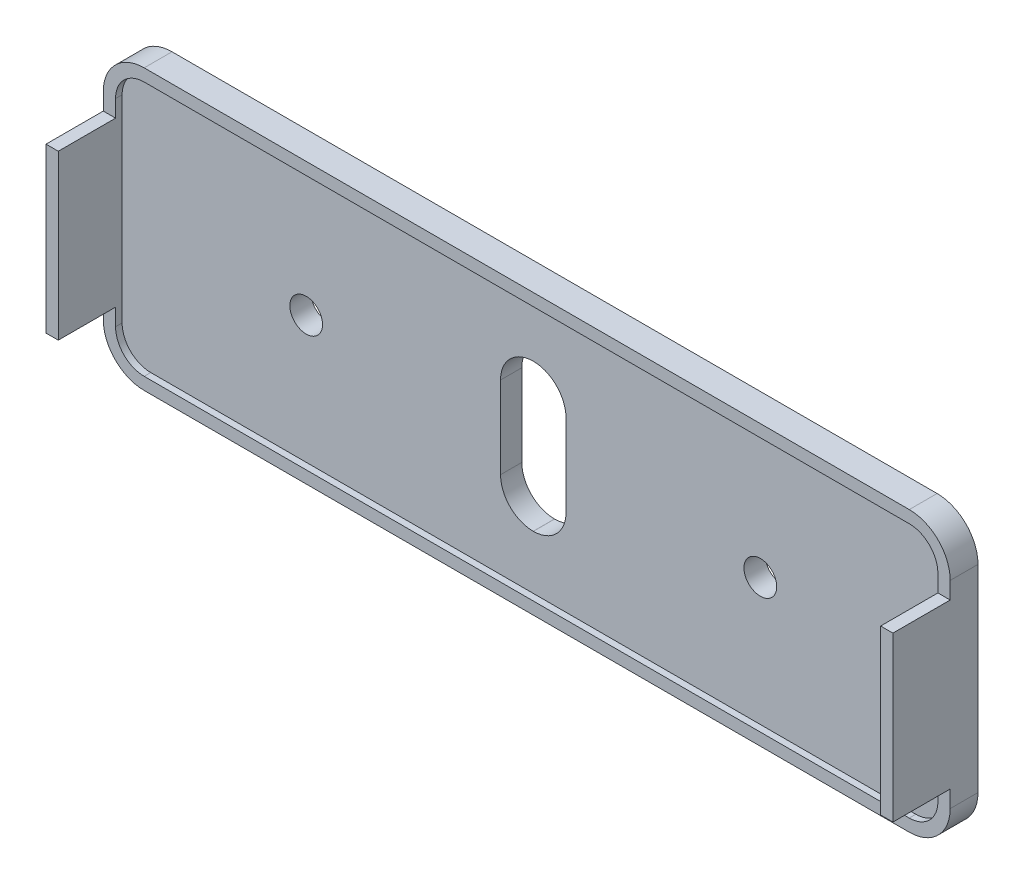
ISO-10303-21;
HEADER;
FILE_DESCRIPTION(('STEP AP214'),'2;1');
FILE_NAME('part.step','',(''),(''),'','','');
FILE_SCHEMA(('AUTOMOTIVE_DESIGN { 1 0 10303 214 1 1 1 1 }'));
ENDSEC;
DATA;
#1=APPLICATION_CONTEXT('core data for automotive mechanical design processes');
#2=APPLICATION_PROTOCOL_DEFINITION('international standard','automotive_design',2000,#1);
#3=PRODUCT_CONTEXT('',#1,'mechanical');
#4=PRODUCT('Part','Part','',(#3));
#5=PRODUCT_RELATED_PRODUCT_CATEGORY('part','',(#4));
#6=PRODUCT_DEFINITION_FORMATION('','',#4);
#7=PRODUCT_DEFINITION_CONTEXT('part definition',#1,'design');
#8=PRODUCT_DEFINITION('design','',#6,#7);
#9=PRODUCT_DEFINITION_SHAPE('','',#8);
#10=(LENGTH_UNIT() NAMED_UNIT(*) SI_UNIT(.MILLI.,.METRE.));
#11=(NAMED_UNIT(*) PLANE_ANGLE_UNIT() SI_UNIT($,.RADIAN.));
#12=(NAMED_UNIT(*) SI_UNIT($,.STERADIAN.) SOLID_ANGLE_UNIT());
#13=UNCERTAINTY_MEASURE_WITH_UNIT(LENGTH_MEASURE(1.E-05),#10,'distance_accuracy_value','');
#14=(GEOMETRIC_REPRESENTATION_CONTEXT(3) GLOBAL_UNCERTAINTY_ASSIGNED_CONTEXT((#13)) GLOBAL_UNIT_ASSIGNED_CONTEXT((#10,
#11,#12)) REPRESENTATION_CONTEXT('',''));
#15=CARTESIAN_POINT('',(0.,0.,0.));
#16=DIRECTION('',(0.,0.,1.));
#17=DIRECTION('',(1.,0.,0.));
#18=AXIS2_PLACEMENT_3D('',#15,#16,#17);
#19=CARTESIAN_POINT('',(-46.75,12.075,3.4));
#20=DIRECTION('',(0.,0.,1.));
#21=DIRECTION('',(1.,0.,0.));
#22=AXIS2_PLACEMENT_3D('',#19,#20,#21);
#23=PLANE('',#22);
#24=DIRECTION('',(-1.,0.,0.));
#25=VECTOR('',#24,1.);
#26=CARTESIAN_POINT('',(51.75,-10.,3.4));
#27=LINE('',#26,#25);
#28=CARTESIAN_POINT('',(51.75,-10.,3.4));
#29=VERTEX_POINT('',#28);
#30=CARTESIAN_POINT('',(50.25,-10.,3.4));
#31=VERTEX_POINT('',#30);
#32=EDGE_CURVE('E290',#29,#31,#27,.T.);
#33=ORIENTED_EDGE('',*,*,#32,.T.);
#34=DIRECTION('',(0.,1.,0.));
#35=VECTOR('',#34,1.);
#36=CARTESIAN_POINT('',(50.25,0.,3.4));
#37=LINE('',#36,#35);
#38=CARTESIAN_POINT('',(50.25,-12.075,3.4));
#39=VERTEX_POINT('',#38);
#40=EDGE_CURVE('E261',#39,#31,#37,.T.);
#41=ORIENTED_EDGE('',*,*,#40,.F.);
#42=CARTESIAN_POINT('',(46.75,-12.075,3.4));
#43=DIRECTION('',(0.,0.,1.));
#44=DIRECTION('',(1.,0.,0.));
#45=AXIS2_PLACEMENT_3D('',#42,#43,#44);
#46=CIRCLE('',#45,3.5);
#47=CARTESIAN_POINT('',(46.75,-15.575,3.4));
#48=VERTEX_POINT('',#47);
#49=EDGE_CURVE('E342',#48,#39,#46,.T.);
#50=ORIENTED_EDGE('',*,*,#49,.F.);
#51=DIRECTION('',(1.,0.,0.));
#52=VECTOR('',#51,1.);
#53=CARTESIAN_POINT('',(0.,-15.575,3.4));
#54=LINE('',#53,#52);
#55=CARTESIAN_POINT('',(-46.75,-15.575,3.4));
#56=VERTEX_POINT('',#55);
#57=EDGE_CURVE('E426',#56,#48,#54,.T.);
#58=ORIENTED_EDGE('',*,*,#57,.F.);
#59=CARTESIAN_POINT('',(-46.75,-12.075,3.4));
#60=DIRECTION('',(0.,0.,1.));
#61=DIRECTION('',(1.,0.,0.));
#62=AXIS2_PLACEMENT_3D('',#59,#60,#61);
#63=CIRCLE('',#62,3.5);
#64=CARTESIAN_POINT('',(-50.25,-12.075,3.4));
#65=VERTEX_POINT('',#64);
#66=EDGE_CURVE('E422',#65,#56,#63,.T.);
#67=ORIENTED_EDGE('',*,*,#66,.F.);
#68=DIRECTION('',(0.,-1.,0.));
#69=VECTOR('',#68,1.);
#70=CARTESIAN_POINT('',(-50.25,0.,3.4));
#71=LINE('',#70,#69);
#72=CARTESIAN_POINT('',(-50.25,-10.,3.4));
#73=VERTEX_POINT('',#72);
#74=EDGE_CURVE('E417',#73,#65,#71,.T.);
#75=ORIENTED_EDGE('',*,*,#74,.F.);
#76=DIRECTION('',(1.,0.,0.));
#77=VECTOR('',#76,1.);
#78=CARTESIAN_POINT('',(-51.75,-10.,3.4));
#79=LINE('',#78,#77);
#80=CARTESIAN_POINT('',(-51.75,-10.,3.4));
#81=VERTEX_POINT('',#80);
#82=EDGE_CURVE('E69',#81,#73,#79,.T.);
#83=ORIENTED_EDGE('',*,*,#82,.F.);
#84=DIRECTION('',(0.,-1.,0.));
#85=VECTOR('',#84,1.);
#86=CARTESIAN_POINT('',(-51.75,12.075,3.4));
#87=LINE('',#86,#85);
#88=CARTESIAN_POINT('',(-51.75,-12.075,3.4));
#89=VERTEX_POINT('',#88);
#90=EDGE_CURVE('E527',#81,#89,#87,.T.);
#91=ORIENTED_EDGE('',*,*,#90,.T.);
#92=CARTESIAN_POINT('',(-46.75,-12.075,3.4));
#93=DIRECTION('',(0.,0.,1.));
#94=DIRECTION('',(1.,0.,0.));
#95=AXIS2_PLACEMENT_3D('',#92,#93,#94);
#96=CIRCLE('',#95,5.);
#97=CARTESIAN_POINT('',(-46.75,-17.075,3.4));
#98=VERTEX_POINT('',#97);
#99=EDGE_CURVE('E532',#89,#98,#96,.T.);
#100=ORIENTED_EDGE('',*,*,#99,.T.);
#101=DIRECTION('',(1.,0.,0.));
#102=VECTOR('',#101,1.);
#103=CARTESIAN_POINT('',(-46.75,-17.075,3.4));
#104=LINE('',#103,#102);
#105=CARTESIAN_POINT('',(46.75,-17.075,3.4));
#106=VERTEX_POINT('',#105);
#107=EDGE_CURVE('E535',#98,#106,#104,.T.);
#108=ORIENTED_EDGE('',*,*,#107,.T.);
#109=CARTESIAN_POINT('',(46.75,-12.075,3.4));
#110=DIRECTION('',(0.,0.,1.));
#111=DIRECTION('',(1.,0.,0.));
#112=AXIS2_PLACEMENT_3D('',#109,#110,#111);
#113=CIRCLE('',#112,5.);
#114=CARTESIAN_POINT('',(51.75,-12.075,3.4));
#115=VERTEX_POINT('',#114);
#116=EDGE_CURVE('E538',#106,#115,#113,.T.);
#117=ORIENTED_EDGE('',*,*,#116,.T.);
#118=DIRECTION('',(0.,1.,0.));
#119=VECTOR('',#118,1.);
#120=CARTESIAN_POINT('',(51.75,12.075,3.4));
#121=LINE('',#120,#119);
#122=EDGE_CURVE('E542',#115,#29,#121,.T.);
#123=ORIENTED_EDGE('',*,*,#122,.T.);
#124=EDGE_LOOP('',(#33,#41,#50,#58,#67,#75,#83,#91,#100,#108,#117,#123));
#125=FACE_BOUND('',#124,.T.);
#126=ADVANCED_FACE('F45',(#125),#23,.T.);
#127=CARTESIAN_POINT('',(-27.75,0.,3.4));
#128=DIRECTION('',(0.,0.,-1.));
#129=DIRECTION('',(-1.,0.,0.));
#130=AXIS2_PLACEMENT_3D('',#127,#128,#129);
#131=CYLINDRICAL_SURFACE('',#130,2.);
#132=CARTESIAN_POINT('',(-27.75,0.,0.));
#133=DIRECTION('',(0.,0.,1.));
#134=DIRECTION('',(1.,0.,0.));
#135=AXIS2_PLACEMENT_3D('',#132,#133,#134);
#136=CIRCLE('',#135,2.);
#137=CARTESIAN_POINT('',(-25.75,0.,0.));
#138=VERTEX_POINT('',#137);
#139=EDGE_CURVE('E518',#138,#138,#136,.T.);
#140=ORIENTED_EDGE('',*,*,#139,.F.);
#141=EDGE_LOOP('',(#140));
#142=FACE_BOUND('',#141,.T.);
#143=CARTESIAN_POINT('',(-27.75,0.,2.6));
#144=DIRECTION('',(0.,0.,1.));
#145=DIRECTION('',(1.,0.,0.));
#146=AXIS2_PLACEMENT_3D('',#143,#144,#145);
#147=CIRCLE('',#146,2.);
#148=CARTESIAN_POINT('',(-25.75,0.,2.6));
#149=VERTEX_POINT('',#148);
#150=EDGE_CURVE('E337',#149,#149,#147,.F.);
#151=ORIENTED_EDGE('',*,*,#150,.F.);
#152=EDGE_LOOP('',(#151));
#153=FACE_BOUND('',#152,.T.);
#154=ADVANCED_FACE('F684',(#142,#153),#131,.F.);
#155=CARTESIAN_POINT('',(27.75,0.,3.4));
#156=DIRECTION('',(0.,0.,-1.));
#157=DIRECTION('',(-1.,0.,0.));
#158=AXIS2_PLACEMENT_3D('',#155,#156,#157);
#159=CYLINDRICAL_SURFACE('',#158,2.);
#160=CARTESIAN_POINT('',(27.75,0.,0.));
#161=DIRECTION('',(0.,0.,1.));
#162=DIRECTION('',(1.,0.,0.));
#163=AXIS2_PLACEMENT_3D('',#160,#161,#162);
#164=CIRCLE('',#163,2.);
#165=CARTESIAN_POINT('',(29.75,0.,0.));
#166=VERTEX_POINT('',#165);
#167=EDGE_CURVE('E514',#166,#166,#164,.T.);
#168=ORIENTED_EDGE('',*,*,#167,.F.);
#169=EDGE_LOOP('',(#168));
#170=FACE_BOUND('',#169,.T.);
#171=CARTESIAN_POINT('',(27.75,0.,2.6));
#172=DIRECTION('',(0.,0.,1.));
#173=DIRECTION('',(1.,0.,0.));
#174=AXIS2_PLACEMENT_3D('',#171,#172,#173);
#175=CIRCLE('',#174,2.);
#176=CARTESIAN_POINT('',(29.75,0.,2.6));
#177=VERTEX_POINT('',#176);
#178=EDGE_CURVE('E341',#177,#177,#175,.F.);
#179=ORIENTED_EDGE('',*,*,#178,.F.);
#180=EDGE_LOOP('',(#179));
#181=FACE_BOUND('',#180,.T.);
#182=ADVANCED_FACE('F691',(#170,#181),#159,.F.);
#183=CARTESIAN_POINT('',(0.00999999999999092,-5.01000000000001,3.4));
#184=DIRECTION('',(0.,0.,-1.));
#185=DIRECTION('',(-1.,0.,0.));
#186=AXIS2_PLACEMENT_3D('',#183,#184,#185);
#187=CYLINDRICAL_SURFACE('',#186,3.99);
#188=DIRECTION('',(0.,0.,-1.));
#189=VECTOR('',#188,1.);
#190=CARTESIAN_POINT('',(0.00999999999996143,-9.00000000000001,3.4));
#191=LINE('',#190,#189);
#192=CARTESIAN_POINT('',(0.00999999999996143,-9.00000000000001,2.6));
#193=VERTEX_POINT('',#192);
#194=CARTESIAN_POINT('',(0.00999999999996143,-9.00000000000001,0.));
#195=VERTEX_POINT('',#194);
#196=EDGE_CURVE('E490',#193,#195,#191,.T.);
#197=ORIENTED_EDGE('',*,*,#196,.F.);
#198=CARTESIAN_POINT('',(0.00999999999999092,-5.01000000000001,2.6));
#199=DIRECTION('',(0.,0.,1.));
#200=DIRECTION('',(1.,0.,0.));
#201=AXIS2_PLACEMENT_3D('',#198,#199,#200);
#202=CIRCLE('',#201,3.99);
#203=CARTESIAN_POINT('',(3.99999999999999,-5.01000000000001,2.6));
#204=VERTEX_POINT('',#203);
#205=EDGE_CURVE('E352',#204,#193,#202,.F.);
#206=ORIENTED_EDGE('',*,*,#205,.F.);
#207=DIRECTION('',(0.,0.,-1.));
#208=VECTOR('',#207,1.);
#209=CARTESIAN_POINT('',(3.99999999999999,-5.00999999999998,3.4));
#210=LINE('',#209,#208);
#211=CARTESIAN_POINT('',(3.99999999999999,-5.00999999999998,0.));
#212=VERTEX_POINT('',#211);
#213=EDGE_CURVE('E511',#204,#212,#210,.T.);
#214=ORIENTED_EDGE('',*,*,#213,.T.);
#215=CARTESIAN_POINT('',(0.00999999999999092,-5.01000000000001,0.));
#216=DIRECTION('',(0.,0.,1.));
#217=DIRECTION('',(1.,0.,0.));
#218=AXIS2_PLACEMENT_3D('',#215,#216,#217);
#219=CIRCLE('',#218,3.99);
#220=EDGE_CURVE('E436',#195,#212,#219,.T.);
#221=ORIENTED_EDGE('',*,*,#220,.F.);
#222=EDGE_LOOP('',(#197,#206,#214,#221));
#223=FACE_BOUND('',#222,.T.);
#224=ADVANCED_FACE('F734',(#223),#187,.F.);
#225=CARTESIAN_POINT('',(3.99999999999999,5.00999999999997,3.4));
#226=DIRECTION('',(-1.,0.,0.));
#227=DIRECTION('',(0.,-1.,0.));
#228=AXIS2_PLACEMENT_3D('',#225,#226,#227);
#229=PLANE('',#228);
#230=ORIENTED_EDGE('',*,*,#213,.F.);
#231=DIRECTION('',(0.,-1.,0.));
#232=VECTOR('',#231,1.);
#233=CARTESIAN_POINT('',(3.99999999999999,0.,2.6));
#234=LINE('',#233,#232);
#235=CARTESIAN_POINT('',(3.99999999999999,5.00999999999999,2.6));
#236=VERTEX_POINT('',#235);
#237=EDGE_CURVE('E349',#236,#204,#234,.T.);
#238=ORIENTED_EDGE('',*,*,#237,.F.);
#239=DIRECTION('',(0.,0.,-1.));
#240=VECTOR('',#239,1.);
#241=CARTESIAN_POINT('',(3.99999999999999,5.00999999999997,3.4));
#242=LINE('',#241,#240);
#243=CARTESIAN_POINT('',(3.99999999999999,5.00999999999997,0.));
#244=VERTEX_POINT('',#243);
#245=EDGE_CURVE('E508',#236,#244,#242,.T.);
#246=ORIENTED_EDGE('',*,*,#245,.T.);
#247=DIRECTION('',(0.,1.,0.));
#248=VECTOR('',#247,1.);
#249=CARTESIAN_POINT('',(3.99999999999999,5.00999999999997,0.));
#250=LINE('',#249,#248);
#251=EDGE_CURVE('E462',#212,#244,#250,.T.);
#252=ORIENTED_EDGE('',*,*,#251,.F.);
#253=EDGE_LOOP('',(#230,#238,#246,#252));
#254=FACE_BOUND('',#253,.T.);
#255=ADVANCED_FACE('F730',(#254),#229,.T.);
#256=CARTESIAN_POINT('',(0.00999999999998918,5.00999999999999,3.4));
#257=DIRECTION('',(0.,0.,-1.));
#258=DIRECTION('',(-1.,0.,0.));
#259=AXIS2_PLACEMENT_3D('',#256,#257,#258);
#260=CYLINDRICAL_SURFACE('',#259,3.99);
#261=ORIENTED_EDGE('',*,*,#245,.F.);
#262=CARTESIAN_POINT('',(0.00999999999998918,5.00999999999999,2.6));
#263=DIRECTION('',(0.,0.,1.));
#264=DIRECTION('',(1.,0.,0.));
#265=AXIS2_PLACEMENT_3D('',#262,#263,#264);
#266=CIRCLE('',#265,3.99);
#267=CARTESIAN_POINT('',(0.00999999999996059,8.99999999999999,2.6));
#268=VERTEX_POINT('',#267);
#269=EDGE_CURVE('E346',#268,#236,#266,.F.);
#270=ORIENTED_EDGE('',*,*,#269,.F.);
#271=DIRECTION('',(0.,0.,-1.));
#272=VECTOR('',#271,1.);
#273=CARTESIAN_POINT('',(0.00999999999996056,8.99999999999999,3.4));
#274=LINE('',#273,#272);
#275=CARTESIAN_POINT('',(0.00999999999996056,8.99999999999999,0.));
#276=VERTEX_POINT('',#275);
#277=EDGE_CURVE('E505',#268,#276,#274,.T.);
#278=ORIENTED_EDGE('',*,*,#277,.T.);
#279=CARTESIAN_POINT('',(0.00999999999998918,5.00999999999999,0.));
#280=DIRECTION('',(0.,0.,1.));
#281=DIRECTION('',(-1.,0.,0.));
#282=AXIS2_PLACEMENT_3D('',#279,#280,#281);
#283=CIRCLE('',#282,3.99);
#284=EDGE_CURVE('E466',#244,#276,#283,.T.);
#285=ORIENTED_EDGE('',*,*,#284,.F.);
#286=EDGE_LOOP('',(#261,#270,#278,#285));
#287=FACE_BOUND('',#286,.T.);
#288=ADVANCED_FACE('F726',(#287),#260,.F.);
#289=CARTESIAN_POINT('',(-0.00999999999998138,8.99999999999999,3.4));
#290=DIRECTION('',(0.,-1.,0.));
#291=DIRECTION('',(0.,0.,-1.));
#292=AXIS2_PLACEMENT_3D('',#289,#290,#291);
#293=PLANE('',#292);
#294=ORIENTED_EDGE('',*,*,#277,.F.);
#295=DIRECTION('',(1.,0.,0.));
#296=VECTOR('',#295,1.);
#297=CARTESIAN_POINT('',(0.,8.99999999999999,2.6));
#298=LINE('',#297,#296);
#299=CARTESIAN_POINT('',(-0.00999999999998139,8.99999999999999,2.6));
#300=VERTEX_POINT('',#299);
#301=EDGE_CURVE('E367',#300,#268,#298,.T.);
#302=ORIENTED_EDGE('',*,*,#301,.F.);
#303=DIRECTION('',(0.,0.,-1.));
#304=VECTOR('',#303,1.);
#305=CARTESIAN_POINT('',(-0.00999999999998139,8.99999999999999,3.4));
#306=LINE('',#305,#304);
#307=CARTESIAN_POINT('',(-0.00999999999998139,8.99999999999999,0.));
#308=VERTEX_POINT('',#307);
#309=EDGE_CURVE('E502',#300,#308,#306,.T.);
#310=ORIENTED_EDGE('',*,*,#309,.T.);
#311=DIRECTION('',(-1.,0.,0.));
#312=VECTOR('',#311,1.);
#313=CARTESIAN_POINT('',(-0.00999999999998138,8.99999999999999,0.));
#314=LINE('',#313,#312);
#315=EDGE_CURVE('E470',#276,#308,#314,.T.);
#316=ORIENTED_EDGE('',*,*,#315,.F.);
#317=EDGE_LOOP('',(#294,#302,#310,#316));
#318=FACE_BOUND('',#317,.T.);
#319=ADVANCED_FACE('F722',(#318),#293,.T.);
#320=CARTESIAN_POINT('',(-0.0100000000000109,5.00999999999999,3.4));
#321=DIRECTION('',(0.,0.,-1.));
#322=DIRECTION('',(-1.,0.,0.));
#323=AXIS2_PLACEMENT_3D('',#320,#321,#322);
#324=CYLINDRICAL_SURFACE('',#323,3.99);
#325=ORIENTED_EDGE('',*,*,#309,.F.);
#326=CARTESIAN_POINT('',(-0.0100000000000109,5.00999999999999,2.6));
#327=DIRECTION('',(0.,0.,1.));
#328=DIRECTION('',(1.,0.,0.));
#329=AXIS2_PLACEMENT_3D('',#326,#327,#328);
#330=CIRCLE('',#329,3.99);
#331=CARTESIAN_POINT('',(-4.00000000000001,5.00999999999997,2.6));
#332=VERTEX_POINT('',#331);
#333=EDGE_CURVE('E364',#332,#300,#330,.F.);
#334=ORIENTED_EDGE('',*,*,#333,.F.);
#335=DIRECTION('',(0.,0.,-1.));
#336=VECTOR('',#335,1.);
#337=CARTESIAN_POINT('',(-4.00000000000001,5.00999999999997,3.4));
#338=LINE('',#337,#336);
#339=CARTESIAN_POINT('',(-4.00000000000001,5.00999999999997,0.));
#340=VERTEX_POINT('',#339);
#341=EDGE_CURVE('E499',#332,#340,#338,.T.);
#342=ORIENTED_EDGE('',*,*,#341,.T.);
#343=CARTESIAN_POINT('',(-0.0100000000000109,5.00999999999999,0.));
#344=DIRECTION('',(0.,0.,1.));
#345=DIRECTION('',(1.,0.,0.));
#346=AXIS2_PLACEMENT_3D('',#343,#344,#345);
#347=CIRCLE('',#346,3.99);
#348=EDGE_CURVE('E474',#308,#340,#347,.T.);
#349=ORIENTED_EDGE('',*,*,#348,.F.);
#350=EDGE_LOOP('',(#325,#334,#342,#349));
#351=FACE_BOUND('',#350,.T.);
#352=ADVANCED_FACE('F718',(#351),#324,.F.);
#353=CARTESIAN_POINT('',(-4.00000000000001,5.00999999999997,3.4));
#354=DIRECTION('',(1.,0.,0.));
#355=DIRECTION('',(0.,1.,0.));
#356=AXIS2_PLACEMENT_3D('',#353,#354,#355);
#357=PLANE('',#356);
#358=ORIENTED_EDGE('',*,*,#341,.F.);
#359=DIRECTION('',(0.,1.,0.));
#360=VECTOR('',#359,1.);
#361=CARTESIAN_POINT('',(-4.00000000000001,0.,2.6));
#362=LINE('',#361,#360);
#363=CARTESIAN_POINT('',(-4.00000000000001,-5.00999999999998,2.6));
#364=VERTEX_POINT('',#363);
#365=EDGE_CURVE('E361',#364,#332,#362,.T.);
#366=ORIENTED_EDGE('',*,*,#365,.F.);
#367=DIRECTION('',(0.,0.,-1.));
#368=VECTOR('',#367,1.);
#369=CARTESIAN_POINT('',(-4.00000000000001,-5.00999999999998,3.4));
#370=LINE('',#369,#368);
#371=CARTESIAN_POINT('',(-4.00000000000001,-5.00999999999998,0.));
#372=VERTEX_POINT('',#371);
#373=EDGE_CURVE('E496',#364,#372,#370,.T.);
#374=ORIENTED_EDGE('',*,*,#373,.T.);
#375=DIRECTION('',(0.,-1.,0.));
#376=VECTOR('',#375,1.);
#377=CARTESIAN_POINT('',(-4.00000000000001,5.00999999999997,0.));
#378=LINE('',#377,#376);
#379=EDGE_CURVE('E478',#340,#372,#378,.T.);
#380=ORIENTED_EDGE('',*,*,#379,.F.);
#381=EDGE_LOOP('',(#358,#366,#374,#380));
#382=FACE_BOUND('',#381,.T.);
#383=ADVANCED_FACE('F709',(#382),#357,.T.);
#384=CARTESIAN_POINT('',(-0.01000000000001,-5.01000000000001,3.4));
#385=DIRECTION('',(0.,0.,-1.));
#386=DIRECTION('',(-1.,0.,0.));
#387=AXIS2_PLACEMENT_3D('',#384,#385,#386);
#388=CYLINDRICAL_SURFACE('',#387,3.99);
#389=ORIENTED_EDGE('',*,*,#373,.F.);
#390=CARTESIAN_POINT('',(-0.01000000000001,-5.01000000000001,2.6));
#391=DIRECTION('',(0.,0.,1.));
#392=DIRECTION('',(1.,0.,0.));
#393=AXIS2_PLACEMENT_3D('',#390,#391,#392);
#394=CIRCLE('',#393,3.99);
#395=CARTESIAN_POINT('',(-0.00999999999998229,-9.00000000000001,2.6));
#396=VERTEX_POINT('',#395);
#397=EDGE_CURVE('E358',#396,#364,#394,.F.);
#398=ORIENTED_EDGE('',*,*,#397,.F.);
#399=DIRECTION('',(0.,0.,-1.));
#400=VECTOR('',#399,1.);
#401=CARTESIAN_POINT('',(-0.00999999999998051,-9.00000000000001,3.4));
#402=LINE('',#401,#400);
#403=CARTESIAN_POINT('',(-0.00999999999998051,-9.00000000000001,0.));
#404=VERTEX_POINT('',#403);
#405=EDGE_CURVE('E493',#396,#404,#402,.T.);
#406=ORIENTED_EDGE('',*,*,#405,.T.);
#407=CARTESIAN_POINT('',(-0.01000000000001,-5.01000000000001,0.));
#408=DIRECTION('',(0.,0.,1.));
#409=DIRECTION('',(1.,0.,0.));
#410=AXIS2_PLACEMENT_3D('',#407,#408,#409);
#411=CIRCLE('',#410,3.99);
#412=EDGE_CURVE('E482',#372,#404,#411,.T.);
#413=ORIENTED_EDGE('',*,*,#412,.F.);
#414=EDGE_LOOP('',(#389,#398,#406,#413));
#415=FACE_BOUND('',#414,.T.);
#416=ADVANCED_FACE('F702',(#415),#388,.F.);
#417=CARTESIAN_POINT('',(-0.00999999999998051,-9.00000000000001,3.4));
#418=DIRECTION('',(0.,1.,0.));
#419=DIRECTION('',(0.,0.,1.));
#420=AXIS2_PLACEMENT_3D('',#417,#418,#419);
#421=PLANE('',#420);
#422=ORIENTED_EDGE('',*,*,#405,.F.);
#423=DIRECTION('',(-1.,0.,0.));
#424=VECTOR('',#423,1.);
#425=CARTESIAN_POINT('',(0.,-9.00000000000001,2.6));
#426=LINE('',#425,#424);
#427=EDGE_CURVE('E355',#193,#396,#426,.T.);
#428=ORIENTED_EDGE('',*,*,#427,.F.);
#429=ORIENTED_EDGE('',*,*,#196,.T.);
#430=DIRECTION('',(1.,0.,0.));
#431=VECTOR('',#430,1.);
#432=CARTESIAN_POINT('',(-0.00999999999998051,-9.00000000000001,0.));
#433=LINE('',#432,#431);
#434=EDGE_CURVE('E486',#404,#195,#433,.T.);
#435=ORIENTED_EDGE('',*,*,#434,.F.);
#436=EDGE_LOOP('',(#422,#428,#429,#435));
#437=FACE_BOUND('',#436,.T.);
#438=ADVANCED_FACE('F695',(#437),#421,.T.);
#439=DIRECTION('',(1.,0.,0.));
#440=VECTOR('',#439,1.);
#441=CARTESIAN_POINT('',(51.75,10.,3.4));
#442=LINE('',#441,#440);
#443=CARTESIAN_POINT('',(50.25,10.,3.4));
#444=VERTEX_POINT('',#443);
#445=CARTESIAN_POINT('',(51.75,10.,3.4));
#446=VERTEX_POINT('',#445);
#447=EDGE_CURVE('E61',#444,#446,#442,.T.);
#448=ORIENTED_EDGE('',*,*,#447,.T.);
#449=CARTESIAN_POINT('',(51.75,12.075,3.4));
#450=VERTEX_POINT('',#449);
#451=EDGE_CURVE('E541',#446,#450,#121,.T.);
#452=ORIENTED_EDGE('',*,*,#451,.T.);
#453=CARTESIAN_POINT('',(46.75,12.075,3.4));
#454=DIRECTION('',(0.,0.,1.));
#455=DIRECTION('',(-1.,0.,0.));
#456=AXIS2_PLACEMENT_3D('',#453,#454,#455);
#457=CIRCLE('',#456,5.);
#458=CARTESIAN_POINT('',(46.75,17.075,3.4));
#459=VERTEX_POINT('',#458);
#460=EDGE_CURVE('E546',#450,#459,#457,.T.);
#461=ORIENTED_EDGE('',*,*,#460,.T.);
#462=DIRECTION('',(-1.,0.,0.));
#463=VECTOR('',#462,1.);
#464=CARTESIAN_POINT('',(-46.75,17.075,3.4));
#465=LINE('',#464,#463);
#466=CARTESIAN_POINT('',(-46.75,17.075,3.4));
#467=VERTEX_POINT('',#466);
#468=EDGE_CURVE('E549',#459,#467,#465,.T.);
#469=ORIENTED_EDGE('',*,*,#468,.T.);
#470=CARTESIAN_POINT('',(-46.75,12.075,3.4));
#471=DIRECTION('',(0.,0.,1.));
#472=DIRECTION('',(1.,0.,0.));
#473=AXIS2_PLACEMENT_3D('',#470,#471,#472);
#474=CIRCLE('',#473,5.);
#475=CARTESIAN_POINT('',(-51.75,12.075,3.4));
#476=VERTEX_POINT('',#475);
#477=EDGE_CURVE('E523',#467,#476,#474,.T.);
#478=ORIENTED_EDGE('',*,*,#477,.T.);
#479=CARTESIAN_POINT('',(-51.75,10.,3.4));
#480=VERTEX_POINT('',#479);
#481=EDGE_CURVE('E529',#476,#480,#87,.T.);
#482=ORIENTED_EDGE('',*,*,#481,.T.);
#483=DIRECTION('',(-1.,0.,0.));
#484=VECTOR('',#483,1.);
#485=CARTESIAN_POINT('',(-51.75,10.,3.4));
#486=LINE('',#485,#484);
#487=CARTESIAN_POINT('',(-50.25,10.,3.4));
#488=VERTEX_POINT('',#487);
#489=EDGE_CURVE('E267',#488,#480,#486,.T.);
#490=ORIENTED_EDGE('',*,*,#489,.F.);
#491=CARTESIAN_POINT('',(-50.25,12.075,3.4));
#492=VERTEX_POINT('',#491);
#493=EDGE_CURVE('E418',#492,#488,#71,.T.);
#494=ORIENTED_EDGE('',*,*,#493,.F.);
#495=CARTESIAN_POINT('',(-46.75,12.075,3.4));
#496=DIRECTION('',(0.,0.,1.));
#497=DIRECTION('',(1.,0.,0.));
#498=AXIS2_PLACEMENT_3D('',#495,#496,#497);
#499=CIRCLE('',#498,3.5);
#500=CARTESIAN_POINT('',(-46.75,15.575,3.4));
#501=VERTEX_POINT('',#500);
#502=EDGE_CURVE('E413',#501,#492,#499,.T.);
#503=ORIENTED_EDGE('',*,*,#502,.F.);
#504=DIRECTION('',(-1.,0.,0.));
#505=VECTOR('',#504,1.);
#506=CARTESIAN_POINT('',(0.,15.575,3.4));
#507=LINE('',#506,#505);
#508=CARTESIAN_POINT('',(46.75,15.575,3.4));
#509=VERTEX_POINT('',#508);
#510=EDGE_CURVE('E409',#509,#501,#507,.T.);
#511=ORIENTED_EDGE('',*,*,#510,.F.);
#512=CARTESIAN_POINT('',(46.75,12.075,3.4));
#513=DIRECTION('',(0.,0.,1.));
#514=DIRECTION('',(1.,0.,0.));
#515=AXIS2_PLACEMENT_3D('',#512,#513,#514);
#516=CIRCLE('',#515,3.5);
#517=CARTESIAN_POINT('',(50.25,12.075,3.4));
#518=VERTEX_POINT('',#517);
#519=EDGE_CURVE('E405',#518,#509,#516,.T.);
#520=ORIENTED_EDGE('',*,*,#519,.F.);
#521=EDGE_CURVE('E336',#444,#518,#37,.T.);
#522=ORIENTED_EDGE('',*,*,#521,.F.);
#523=EDGE_LOOP('',(#448,#452,#461,#469,#478,#482,#490,#494,#503,#511,#520,#522));
#524=FACE_BOUND('',#523,.T.);
#525=ADVANCED_FACE('F635',(#524),#23,.T.);
#526=CARTESIAN_POINT('',(-46.75,12.075,0.));
#527=DIRECTION('',(0.,0.,1.));
#528=DIRECTION('',(1.,0.,0.));
#529=AXIS2_PLACEMENT_3D('',#526,#527,#528);
#530=PLANE('',#529);
#531=ORIENTED_EDGE('',*,*,#167,.T.);
#532=EDGE_LOOP('',(#531));
#533=FACE_BOUND('',#532,.T.);
#534=ORIENTED_EDGE('',*,*,#139,.T.);
#535=EDGE_LOOP('',(#534));
#536=FACE_BOUND('',#535,.T.);
#537=CARTESIAN_POINT('',(-46.75,12.075,0.));
#538=DIRECTION('',(0.,0.,1.));
#539=DIRECTION('',(1.,0.,0.));
#540=AXIS2_PLACEMENT_3D('',#537,#538,#539);
#541=CIRCLE('',#540,5.);
#542=CARTESIAN_POINT('',(-46.75,17.075,0.));
#543=VERTEX_POINT('',#542);
#544=CARTESIAN_POINT('',(-51.75,12.075,0.));
#545=VERTEX_POINT('',#544);
#546=EDGE_CURVE('E522',#543,#545,#541,.T.);
#547=ORIENTED_EDGE('',*,*,#546,.F.);
#548=DIRECTION('',(-1.,0.,0.));
#549=VECTOR('',#548,1.);
#550=CARTESIAN_POINT('',(-46.75,17.075,0.));
#551=LINE('',#550,#549);
#552=CARTESIAN_POINT('',(46.75,17.075,0.));
#553=VERTEX_POINT('',#552);
#554=EDGE_CURVE('E528',#553,#543,#551,.T.);
#555=ORIENTED_EDGE('',*,*,#554,.F.);
#556=CARTESIAN_POINT('',(46.75,12.075,0.));
#557=DIRECTION('',(0.,0.,1.));
#558=DIRECTION('',(-1.,0.,0.));
#559=AXIS2_PLACEMENT_3D('',#556,#557,#558);
#560=CIRCLE('',#559,5.);
#561=CARTESIAN_POINT('',(51.75,12.075,0.));
#562=VERTEX_POINT('',#561);
#563=EDGE_CURVE('E571',#562,#553,#560,.T.);
#564=ORIENTED_EDGE('',*,*,#563,.F.);
#565=DIRECTION('',(0.,1.,0.));
#566=VECTOR('',#565,1.);
#567=CARTESIAN_POINT('',(51.75,12.075,0.));
#568=LINE('',#567,#566);
#569=CARTESIAN_POINT('',(51.75,-12.075,0.));
#570=VERTEX_POINT('',#569);
#571=EDGE_CURVE('E568',#570,#562,#568,.T.);
#572=ORIENTED_EDGE('',*,*,#571,.F.);
#573=CARTESIAN_POINT('',(46.75,-12.075,0.));
#574=DIRECTION('',(0.,0.,1.));
#575=DIRECTION('',(1.,0.,0.));
#576=AXIS2_PLACEMENT_3D('',#573,#574,#575);
#577=CIRCLE('',#576,5.);
#578=CARTESIAN_POINT('',(46.75,-17.075,0.));
#579=VERTEX_POINT('',#578);
#580=EDGE_CURVE('E565',#579,#570,#577,.T.);
#581=ORIENTED_EDGE('',*,*,#580,.F.);
#582=DIRECTION('',(1.,0.,0.));
#583=VECTOR('',#582,1.);
#584=CARTESIAN_POINT('',(-46.75,-17.075,0.));
#585=LINE('',#584,#583);
#586=CARTESIAN_POINT('',(-46.75,-17.075,0.));
#587=VERTEX_POINT('',#586);
#588=EDGE_CURVE('E562',#587,#579,#585,.T.);
#589=ORIENTED_EDGE('',*,*,#588,.F.);
#590=CARTESIAN_POINT('',(-46.75,-12.075,0.));
#591=DIRECTION('',(0.,0.,1.));
#592=DIRECTION('',(1.,0.,0.));
#593=AXIS2_PLACEMENT_3D('',#590,#591,#592);
#594=CIRCLE('',#593,5.);
#595=CARTESIAN_POINT('',(-51.75,-12.075,0.));
#596=VERTEX_POINT('',#595);
#597=EDGE_CURVE('E559',#596,#587,#594,.T.);
#598=ORIENTED_EDGE('',*,*,#597,.F.);
#599=DIRECTION('',(0.,-1.,0.));
#600=VECTOR('',#599,1.);
#601=CARTESIAN_POINT('',(-51.75,12.075,0.));
#602=LINE('',#601,#600);
#603=EDGE_CURVE('E556',#545,#596,#602,.T.);
#604=ORIENTED_EDGE('',*,*,#603,.F.);
#605=EDGE_LOOP('',(#547,#555,#564,#572,#581,#589,#598,#604));
#606=FACE_BOUND('',#605,.T.);
#607=ORIENTED_EDGE('',*,*,#220,.T.);
#608=ORIENTED_EDGE('',*,*,#251,.T.);
#609=ORIENTED_EDGE('',*,*,#284,.T.);
#610=ORIENTED_EDGE('',*,*,#315,.T.);
#611=ORIENTED_EDGE('',*,*,#348,.T.);
#612=ORIENTED_EDGE('',*,*,#379,.T.);
#613=ORIENTED_EDGE('',*,*,#412,.T.);
#614=ORIENTED_EDGE('',*,*,#434,.T.);
#615=EDGE_LOOP('',(#607,#608,#609,#610,#611,#612,#613,#614));
#616=FACE_BOUND('',#615,.T.);
#617=ADVANCED_FACE('F610',(#533,#536,#606,#616),#530,.F.);
#618=CARTESIAN_POINT('',(-46.75,12.075,3.4));
#619=DIRECTION('',(0.,0.,-1.));
#620=DIRECTION('',(-1.,0.,0.));
#621=AXIS2_PLACEMENT_3D('',#618,#619,#620);
#622=CYLINDRICAL_SURFACE('',#621,5.);
#623=ORIENTED_EDGE('',*,*,#546,.T.);
#624=DIRECTION('',(0.,0.,-1.));
#625=VECTOR('',#624,1.);
#626=CARTESIAN_POINT('',(-51.75,12.075,3.4));
#627=LINE('',#626,#625);
#628=EDGE_CURVE('E11',#476,#545,#627,.T.);
#629=ORIENTED_EDGE('',*,*,#628,.F.);
#630=ORIENTED_EDGE('',*,*,#477,.F.);
#631=DIRECTION('',(0.,0.,-1.));
#632=VECTOR('',#631,1.);
#633=CARTESIAN_POINT('',(-46.75,17.075,3.4));
#634=LINE('',#633,#632);
#635=EDGE_CURVE('E552',#467,#543,#634,.T.);
#636=ORIENTED_EDGE('',*,*,#635,.T.);
#637=EDGE_LOOP('',(#623,#629,#630,#636));
#638=FACE_BOUND('',#637,.T.);
#639=ADVANCED_FACE('F47',(#638),#622,.T.);
#640=CARTESIAN_POINT('',(-51.75,12.075,3.4));
#641=DIRECTION('',(1.,0.,0.));
#642=DIRECTION('',(0.,0.,-1.));
#643=AXIS2_PLACEMENT_3D('',#640,#641,#642);
#644=PLANE('',#643);
#645=ORIENTED_EDGE('',*,*,#603,.T.);
#646=DIRECTION('',(0.,0.,-1.));
#647=VECTOR('',#646,1.);
#648=CARTESIAN_POINT('',(-51.75,-12.075,3.4));
#649=LINE('',#648,#647);
#650=EDGE_CURVE('E54',#89,#596,#649,.T.);
#651=ORIENTED_EDGE('',*,*,#650,.F.);
#652=ORIENTED_EDGE('',*,*,#90,.F.);
#653=DIRECTION('',(0.,0.,-1.));
#654=VECTOR('',#653,1.);
#655=CARTESIAN_POINT('',(-51.75,-10.,10.4));
#656=LINE('',#655,#654);
#657=CARTESIAN_POINT('',(-51.75,-10.,10.4));
#658=VERTEX_POINT('',#657);
#659=EDGE_CURVE('E324',#658,#81,#656,.T.);
#660=ORIENTED_EDGE('',*,*,#659,.F.);
#661=DIRECTION('',(0.,-1.,0.));
#662=VECTOR('',#661,1.);
#663=CARTESIAN_POINT('',(-51.75,10.,10.4));
#664=LINE('',#663,#662);
#665=CARTESIAN_POINT('',(-51.75,10.,10.4));
#666=VERTEX_POINT('',#665);
#667=EDGE_CURVE('E309',#666,#658,#664,.T.);
#668=ORIENTED_EDGE('',*,*,#667,.F.);
#669=DIRECTION('',(0.,0.,-1.));
#670=VECTOR('',#669,1.);
#671=CARTESIAN_POINT('',(-51.75,10.,10.4));
#672=LINE('',#671,#670);
#673=EDGE_CURVE('E328',#666,#480,#672,.T.);
#674=ORIENTED_EDGE('',*,*,#673,.T.);
#675=ORIENTED_EDGE('',*,*,#481,.F.);
#676=ORIENTED_EDGE('',*,*,#628,.T.);
#677=EDGE_LOOP('',(#645,#651,#652,#660,#668,#674,#675,#676));
#678=FACE_BOUND('',#677,.T.);
#679=ADVANCED_FACE('F665',(#678),#644,.F.);
#680=CARTESIAN_POINT('',(-46.75,-12.075,3.4));
#681=DIRECTION('',(0.,0.,-1.));
#682=DIRECTION('',(-1.,0.,0.));
#683=AXIS2_PLACEMENT_3D('',#680,#681,#682);
#684=CYLINDRICAL_SURFACE('',#683,5.);
#685=ORIENTED_EDGE('',*,*,#597,.T.);
#686=DIRECTION('',(0.,0.,-1.));
#687=VECTOR('',#686,1.);
#688=CARTESIAN_POINT('',(-46.75,-17.075,3.4));
#689=LINE('',#688,#687);
#690=EDGE_CURVE('E595',#98,#587,#689,.T.);
#691=ORIENTED_EDGE('',*,*,#690,.F.);
#692=ORIENTED_EDGE('',*,*,#99,.F.);
#693=ORIENTED_EDGE('',*,*,#650,.T.);
#694=EDGE_LOOP('',(#685,#691,#692,#693));
#695=FACE_BOUND('',#694,.T.);
#696=ADVANCED_FACE('F604',(#695),#684,.T.);
#697=CARTESIAN_POINT('',(-46.75,-17.075,3.4));
#698=DIRECTION('',(0.,1.,0.));
#699=DIRECTION('',(0.,0.,1.));
#700=AXIS2_PLACEMENT_3D('',#697,#698,#699);
#701=PLANE('',#700);
#702=ORIENTED_EDGE('',*,*,#588,.T.);
#703=DIRECTION('',(0.,0.,-1.));
#704=VECTOR('',#703,1.);
#705=CARTESIAN_POINT('',(46.75,-17.075,3.4));
#706=LINE('',#705,#704);
#707=EDGE_CURVE('E591',#106,#579,#706,.T.);
#708=ORIENTED_EDGE('',*,*,#707,.F.);
#709=ORIENTED_EDGE('',*,*,#107,.F.);
#710=ORIENTED_EDGE('',*,*,#690,.T.);
#711=EDGE_LOOP('',(#702,#708,#709,#710));
#712=FACE_BOUND('',#711,.T.);
#713=ADVANCED_FACE('F616',(#712),#701,.F.);
#714=CARTESIAN_POINT('',(46.75,-12.075,3.4));
#715=DIRECTION('',(0.,0.,-1.));
#716=DIRECTION('',(-1.,0.,0.));
#717=AXIS2_PLACEMENT_3D('',#714,#715,#716);
#718=CYLINDRICAL_SURFACE('',#717,5.);
#719=ORIENTED_EDGE('',*,*,#580,.T.);
#720=DIRECTION('',(0.,0.,-1.));
#721=VECTOR('',#720,1.);
#722=CARTESIAN_POINT('',(51.75,-12.075,3.4));
#723=LINE('',#722,#721);
#724=EDGE_CURVE('E587',#115,#570,#723,.T.);
#725=ORIENTED_EDGE('',*,*,#724,.F.);
#726=ORIENTED_EDGE('',*,*,#116,.F.);
#727=ORIENTED_EDGE('',*,*,#707,.T.);
#728=EDGE_LOOP('',(#719,#725,#726,#727));
#729=FACE_BOUND('',#728,.T.);
#730=ADVANCED_FACE('F620',(#729),#718,.T.);
#731=CARTESIAN_POINT('',(51.75,12.075,3.4));
#732=DIRECTION('',(-1.,0.,0.));
#733=DIRECTION('',(0.,-1.,0.));
#734=AXIS2_PLACEMENT_3D('',#731,#732,#733);
#735=PLANE('',#734);
#736=ORIENTED_EDGE('',*,*,#571,.T.);
#737=DIRECTION('',(0.,0.,-1.));
#738=VECTOR('',#737,1.);
#739=CARTESIAN_POINT('',(51.75,12.075,3.4));
#740=LINE('',#739,#738);
#741=EDGE_CURVE('E583',#450,#562,#740,.T.);
#742=ORIENTED_EDGE('',*,*,#741,.F.);
#743=ORIENTED_EDGE('',*,*,#451,.F.);
#744=DIRECTION('',(0.,0.,-1.));
#745=VECTOR('',#744,1.);
#746=CARTESIAN_POINT('',(51.75,10.,10.4));
#747=LINE('',#746,#745);
#748=CARTESIAN_POINT('',(51.75,10.,10.4));
#749=VERTEX_POINT('',#748);
#750=EDGE_CURVE('E297',#749,#446,#747,.T.);
#751=ORIENTED_EDGE('',*,*,#750,.F.);
#752=DIRECTION('',(0.,-1.,0.));
#753=VECTOR('',#752,1.);
#754=CARTESIAN_POINT('',(51.75,10.,10.4));
#755=LINE('',#754,#753);
#756=CARTESIAN_POINT('',(51.75,-10.,10.4));
#757=VERTEX_POINT('',#756);
#758=EDGE_CURVE('E282',#749,#757,#755,.T.);
#759=ORIENTED_EDGE('',*,*,#758,.T.);
#760=DIRECTION('',(0.,0.,-1.));
#761=VECTOR('',#760,1.);
#762=CARTESIAN_POINT('',(51.75,-10.,10.4));
#763=LINE('',#762,#761);
#764=EDGE_CURVE('E268',#757,#29,#763,.T.);
#765=ORIENTED_EDGE('',*,*,#764,.T.);
#766=ORIENTED_EDGE('',*,*,#122,.F.);
#767=ORIENTED_EDGE('',*,*,#724,.T.);
#768=EDGE_LOOP('',(#736,#742,#743,#751,#759,#765,#766,#767));
#769=FACE_BOUND('',#768,.T.);
#770=ADVANCED_FACE('F878',(#769),#735,.F.);
#771=CARTESIAN_POINT('',(46.75,12.075,3.4));
#772=DIRECTION('',(0.,0.,-1.));
#773=DIRECTION('',(-1.,0.,0.));
#774=AXIS2_PLACEMENT_3D('',#771,#772,#773);
#775=CYLINDRICAL_SURFACE('',#774,5.);
#776=ORIENTED_EDGE('',*,*,#563,.T.);
#777=DIRECTION('',(0.,0.,-1.));
#778=VECTOR('',#777,1.);
#779=CARTESIAN_POINT('',(46.75,17.075,3.4));
#780=LINE('',#779,#778);
#781=EDGE_CURVE('E579',#459,#553,#780,.T.);
#782=ORIENTED_EDGE('',*,*,#781,.F.);
#783=ORIENTED_EDGE('',*,*,#460,.F.);
#784=ORIENTED_EDGE('',*,*,#741,.T.);
#785=EDGE_LOOP('',(#776,#782,#783,#784));
#786=FACE_BOUND('',#785,.T.);
#787=ADVANCED_FACE('F868',(#786),#775,.T.);
#788=CARTESIAN_POINT('',(-46.75,17.075,3.4));
#789=DIRECTION('',(0.,-1.,0.));
#790=DIRECTION('',(0.,0.,-1.));
#791=AXIS2_PLACEMENT_3D('',#788,#789,#790);
#792=PLANE('',#791);
#793=ORIENTED_EDGE('',*,*,#554,.T.);
#794=ORIENTED_EDGE('',*,*,#635,.F.);
#795=ORIENTED_EDGE('',*,*,#468,.F.);
#796=ORIENTED_EDGE('',*,*,#781,.T.);
#797=EDGE_LOOP('',(#793,#794,#795,#796));
#798=FACE_BOUND('',#797,.T.);
#799=ADVANCED_FACE('F809',(#798),#792,.F.);
#800=CARTESIAN_POINT('',(50.25,0.,2.6));
#801=DIRECTION('',(1.,0.,0.));
#802=DIRECTION('',(0.,0.,-1.));
#803=AXIS2_PLACEMENT_3D('',#800,#801,#802);
#804=PLANE('',#803);
#805=ORIENTED_EDGE('',*,*,#40,.T.);
#806=DIRECTION('',(0.,0.,-1.));
#807=VECTOR('',#806,1.);
#808=CARTESIAN_POINT('',(50.25,-10.,10.4));
#809=LINE('',#808,#807);
#810=CARTESIAN_POINT('',(50.25,-10.,10.4));
#811=VERTEX_POINT('',#810);
#812=EDGE_CURVE('E255',#811,#31,#809,.T.);
#813=ORIENTED_EDGE('',*,*,#812,.F.);
#814=DIRECTION('',(0.,1.,0.));
#815=VECTOR('',#814,1.);
#816=CARTESIAN_POINT('',(50.25,10.,10.4));
#817=LINE('',#816,#815);
#818=CARTESIAN_POINT('',(50.25,10.,10.4));
#819=VERTEX_POINT('',#818);
#820=EDGE_CURVE('E258',#811,#819,#817,.T.);
#821=ORIENTED_EDGE('',*,*,#820,.T.);
#822=DIRECTION('',(0.,0.,-1.));
#823=VECTOR('',#822,1.);
#824=CARTESIAN_POINT('',(50.25,10.,10.4));
#825=LINE('',#824,#823);
#826=EDGE_CURVE('E289',#819,#444,#825,.T.);
#827=ORIENTED_EDGE('',*,*,#826,.T.);
#828=ORIENTED_EDGE('',*,*,#521,.T.);
#829=DIRECTION('',(0.,0.,1.));
#830=VECTOR('',#829,1.);
#831=CARTESIAN_POINT('',(50.25,12.075,2.6));
#832=LINE('',#831,#830);
#833=CARTESIAN_POINT('',(50.25,12.075,2.6));
#834=VERTEX_POINT('',#833);
#835=EDGE_CURVE('E402',#834,#518,#832,.T.);
#836=ORIENTED_EDGE('',*,*,#835,.F.);
#837=DIRECTION('',(0.,1.,0.));
#838=VECTOR('',#837,1.);
#839=CARTESIAN_POINT('',(50.25,0.,2.6));
#840=LINE('',#839,#838);
#841=CARTESIAN_POINT('',(50.25,-12.075,2.6));
#842=VERTEX_POINT('',#841);
#843=EDGE_CURVE('E370',#842,#834,#840,.T.);
#844=ORIENTED_EDGE('',*,*,#843,.F.);
#845=DIRECTION('',(0.,0.,1.));
#846=VECTOR('',#845,1.);
#847=CARTESIAN_POINT('',(50.25,-12.075,2.6));
#848=LINE('',#847,#846);
#849=EDGE_CURVE('E433',#842,#39,#848,.T.);
#850=ORIENTED_EDGE('',*,*,#849,.T.);
#851=EDGE_LOOP('',(#805,#813,#821,#827,#828,#836,#844,#850));
#852=FACE_BOUND('',#851,.T.);
#853=ADVANCED_FACE('F257',(#852),#804,.F.);
#854=CARTESIAN_POINT('',(46.75,-12.075,2.6));
#855=DIRECTION('',(0.,0.,1.));
#856=DIRECTION('',(1.,0.,0.));
#857=AXIS2_PLACEMENT_3D('',#854,#855,#856);
#858=CYLINDRICAL_SURFACE('',#857,3.5);
#859=ORIENTED_EDGE('',*,*,#49,.T.);
#860=ORIENTED_EDGE('',*,*,#849,.F.);
#861=CARTESIAN_POINT('',(46.75,-12.075,2.6));
#862=DIRECTION('',(0.,0.,1.));
#863=DIRECTION('',(1.,0.,0.));
#864=AXIS2_PLACEMENT_3D('',#861,#862,#863);
#865=CIRCLE('',#864,3.5);
#866=CARTESIAN_POINT('',(46.75,-15.575,2.6));
#867=VERTEX_POINT('',#866);
#868=EDGE_CURVE('E398',#867,#842,#865,.T.);
#869=ORIENTED_EDGE('',*,*,#868,.F.);
#870=DIRECTION('',(0.,0.,1.));
#871=VECTOR('',#870,1.);
#872=CARTESIAN_POINT('',(46.75,-15.575,2.6));
#873=LINE('',#872,#871);
#874=EDGE_CURVE('E437',#867,#48,#873,.T.);
#875=ORIENTED_EDGE('',*,*,#874,.T.);
#876=EDGE_LOOP('',(#859,#860,#869,#875));
#877=FACE_BOUND('',#876,.T.);
#878=ADVANCED_FACE('F647',(#877),#858,.F.);
#879=CARTESIAN_POINT('',(0.,-15.575,2.6));
#880=DIRECTION('',(0.,-1.,0.));
#881=DIRECTION('',(1.,0.,0.));
#882=AXIS2_PLACEMENT_3D('',#879,#880,#881);
#883=PLANE('',#882);
#884=ORIENTED_EDGE('',*,*,#57,.T.);
#885=ORIENTED_EDGE('',*,*,#874,.F.);
#886=DIRECTION('',(1.,0.,0.));
#887=VECTOR('',#886,1.);
#888=CARTESIAN_POINT('',(0.,-15.575,2.6));
#889=LINE('',#888,#887);
#890=CARTESIAN_POINT('',(-46.75,-15.575,2.6));
#891=VERTEX_POINT('',#890);
#892=EDGE_CURVE('E394',#891,#867,#889,.T.);
#893=ORIENTED_EDGE('',*,*,#892,.F.);
#894=DIRECTION('',(0.,0.,1.));
#895=VECTOR('',#894,1.);
#896=CARTESIAN_POINT('',(-46.75,-15.575,2.6));
#897=LINE('',#896,#895);
#898=EDGE_CURVE('E440',#891,#56,#897,.T.);
#899=ORIENTED_EDGE('',*,*,#898,.T.);
#900=EDGE_LOOP('',(#884,#885,#893,#899));
#901=FACE_BOUND('',#900,.T.);
#902=ADVANCED_FACE('F651',(#901),#883,.F.);
#903=CARTESIAN_POINT('',(-46.75,-12.075,2.6));
#904=DIRECTION('',(0.,0.,1.));
#905=DIRECTION('',(1.,0.,0.));
#906=AXIS2_PLACEMENT_3D('',#903,#904,#905);
#907=CYLINDRICAL_SURFACE('',#906,3.5);
#908=ORIENTED_EDGE('',*,*,#66,.T.);
#909=ORIENTED_EDGE('',*,*,#898,.F.);
#910=CARTESIAN_POINT('',(-46.75,-12.075,2.6));
#911=DIRECTION('',(0.,0.,1.));
#912=DIRECTION('',(1.,0.,0.));
#913=AXIS2_PLACEMENT_3D('',#910,#911,#912);
#914=CIRCLE('',#913,3.5);
#915=CARTESIAN_POINT('',(-50.25,-12.075,2.6));
#916=VERTEX_POINT('',#915);
#917=EDGE_CURVE('E390',#916,#891,#914,.T.);
#918=ORIENTED_EDGE('',*,*,#917,.F.);
#919=DIRECTION('',(0.,0.,1.));
#920=VECTOR('',#919,1.);
#921=CARTESIAN_POINT('',(-50.25,-12.075,2.6));
#922=LINE('',#921,#920);
#923=EDGE_CURVE('E443',#916,#65,#922,.T.);
#924=ORIENTED_EDGE('',*,*,#923,.T.);
#925=EDGE_LOOP('',(#908,#909,#918,#924));
#926=FACE_BOUND('',#925,.T.);
#927=ADVANCED_FACE('F655',(#926),#907,.F.);
#928=CARTESIAN_POINT('',(-50.25,0.,2.6));
#929=DIRECTION('',(-1.,0.,0.));
#930=DIRECTION('',(0.,0.,1.));
#931=AXIS2_PLACEMENT_3D('',#928,#929,#930);
#932=PLANE('',#931);
#933=ORIENTED_EDGE('',*,*,#493,.T.);
#934=DIRECTION('',(0.,0.,-1.));
#935=VECTOR('',#934,1.);
#936=CARTESIAN_POINT('',(-50.25,10.,10.4));
#937=LINE('',#936,#935);
#938=CARTESIAN_POINT('',(-50.25,10.,10.4));
#939=VERTEX_POINT('',#938);
#940=EDGE_CURVE('E332',#939,#488,#937,.T.);
#941=ORIENTED_EDGE('',*,*,#940,.F.);
#942=DIRECTION('',(0.,1.,0.));
#943=VECTOR('',#942,1.);
#944=CARTESIAN_POINT('',(-50.25,10.,10.4));
#945=LINE('',#944,#943);
#946=CARTESIAN_POINT('',(-50.25,-10.,10.4));
#947=VERTEX_POINT('',#946);
#948=EDGE_CURVE('E302',#947,#939,#945,.T.);
#949=ORIENTED_EDGE('',*,*,#948,.F.);
#950=DIRECTION('',(0.,0.,-1.));
#951=VECTOR('',#950,1.);
#952=CARTESIAN_POINT('',(-50.25,-10.,10.4));
#953=LINE('',#952,#951);
#954=EDGE_CURVE('E315',#947,#73,#953,.T.);
#955=ORIENTED_EDGE('',*,*,#954,.T.);
#956=ORIENTED_EDGE('',*,*,#74,.T.);
#957=ORIENTED_EDGE('',*,*,#923,.F.);
#958=DIRECTION('',(0.,-1.,0.));
#959=VECTOR('',#958,1.);
#960=CARTESIAN_POINT('',(-50.25,0.,2.6));
#961=LINE('',#960,#959);
#962=CARTESIAN_POINT('',(-50.25,12.075,2.6));
#963=VERTEX_POINT('',#962);
#964=EDGE_CURVE('E386',#963,#916,#961,.T.);
#965=ORIENTED_EDGE('',*,*,#964,.F.);
#966=DIRECTION('',(0.,0.,1.));
#967=VECTOR('',#966,1.);
#968=CARTESIAN_POINT('',(-50.25,12.075,2.6));
#969=LINE('',#968,#967);
#970=EDGE_CURVE('E447',#963,#492,#969,.T.);
#971=ORIENTED_EDGE('',*,*,#970,.T.);
#972=EDGE_LOOP('',(#933,#941,#949,#955,#956,#957,#965,#971));
#973=FACE_BOUND('',#972,.T.);
#974=ADVANCED_FACE('F658',(#973),#932,.F.);
#975=CARTESIAN_POINT('',(-46.75,12.075,2.6));
#976=DIRECTION('',(0.,0.,1.));
#977=DIRECTION('',(1.,0.,0.));
#978=AXIS2_PLACEMENT_3D('',#975,#976,#977);
#979=CYLINDRICAL_SURFACE('',#978,3.5);
#980=ORIENTED_EDGE('',*,*,#502,.T.);
#981=ORIENTED_EDGE('',*,*,#970,.F.);
#982=CARTESIAN_POINT('',(-46.75,12.075,2.6));
#983=DIRECTION('',(0.,0.,1.));
#984=DIRECTION('',(1.,0.,0.));
#985=AXIS2_PLACEMENT_3D('',#982,#983,#984);
#986=CIRCLE('',#985,3.5);
#987=CARTESIAN_POINT('',(-46.75,15.575,2.6));
#988=VERTEX_POINT('',#987);
#989=EDGE_CURVE('E382',#988,#963,#986,.T.);
#990=ORIENTED_EDGE('',*,*,#989,.F.);
#991=DIRECTION('',(0.,0.,1.));
#992=VECTOR('',#991,1.);
#993=CARTESIAN_POINT('',(-46.75,15.575,2.6));
#994=LINE('',#993,#992);
#995=EDGE_CURVE('E450',#988,#501,#994,.T.);
#996=ORIENTED_EDGE('',*,*,#995,.T.);
#997=EDGE_LOOP('',(#980,#981,#990,#996));
#998=FACE_BOUND('',#997,.T.);
#999=ADVANCED_FACE('F673',(#998),#979,.F.);
#1000=CARTESIAN_POINT('',(0.,15.575,2.6));
#1001=DIRECTION('',(0.,1.,0.));
#1002=DIRECTION('',(0.,0.,1.));
#1003=AXIS2_PLACEMENT_3D('',#1000,#1001,#1002);
#1004=PLANE('',#1003);
#1005=ORIENTED_EDGE('',*,*,#510,.T.);
#1006=ORIENTED_EDGE('',*,*,#995,.F.);
#1007=DIRECTION('',(-1.,0.,0.));
#1008=VECTOR('',#1007,1.);
#1009=CARTESIAN_POINT('',(0.,15.575,2.6));
#1010=LINE('',#1009,#1008);
#1011=CARTESIAN_POINT('',(46.75,15.575,2.6));
#1012=VERTEX_POINT('',#1011);
#1013=EDGE_CURVE('E378',#1012,#988,#1010,.T.);
#1014=ORIENTED_EDGE('',*,*,#1013,.F.);
#1015=DIRECTION('',(0.,0.,1.));
#1016=VECTOR('',#1015,1.);
#1017=CARTESIAN_POINT('',(46.75,15.575,2.6));
#1018=LINE('',#1017,#1016);
#1019=EDGE_CURVE('E453',#1012,#509,#1018,.T.);
#1020=ORIENTED_EDGE('',*,*,#1019,.T.);
#1021=EDGE_LOOP('',(#1005,#1006,#1014,#1020));
#1022=FACE_BOUND('',#1021,.T.);
#1023=ADVANCED_FACE('F639',(#1022),#1004,.F.);
#1024=CARTESIAN_POINT('',(46.75,12.075,2.6));
#1025=DIRECTION('',(0.,0.,1.));
#1026=DIRECTION('',(1.,0.,0.));
#1027=AXIS2_PLACEMENT_3D('',#1024,#1025,#1026);
#1028=CYLINDRICAL_SURFACE('',#1027,3.5);
#1029=ORIENTED_EDGE('',*,*,#519,.T.);
#1030=ORIENTED_EDGE('',*,*,#1019,.F.);
#1031=CARTESIAN_POINT('',(46.75,12.075,2.6));
#1032=DIRECTION('',(0.,0.,1.));
#1033=DIRECTION('',(1.,0.,0.));
#1034=AXIS2_PLACEMENT_3D('',#1031,#1032,#1033);
#1035=CIRCLE('',#1034,3.5);
#1036=EDGE_CURVE('E374',#834,#1012,#1035,.T.);
#1037=ORIENTED_EDGE('',*,*,#1036,.F.);
#1038=ORIENTED_EDGE('',*,*,#835,.T.);
#1039=EDGE_LOOP('',(#1029,#1030,#1037,#1038));
#1040=FACE_BOUND('',#1039,.T.);
#1041=ADVANCED_FACE('F633',(#1040),#1028,.F.);
#1042=CARTESIAN_POINT('',(0.,0.,2.6));
#1043=DIRECTION('',(0.,0.,1.));
#1044=DIRECTION('',(1.,0.,0.));
#1045=AXIS2_PLACEMENT_3D('',#1042,#1043,#1044);
#1046=PLANE('',#1045);
#1047=ORIENTED_EDGE('',*,*,#150,.T.);
#1048=EDGE_LOOP('',(#1047));
#1049=FACE_BOUND('',#1048,.T.);
#1050=ORIENTED_EDGE('',*,*,#178,.T.);
#1051=EDGE_LOOP('',(#1050));
#1052=FACE_BOUND('',#1051,.T.);
#1053=ORIENTED_EDGE('',*,*,#269,.T.);
#1054=ORIENTED_EDGE('',*,*,#237,.T.);
#1055=ORIENTED_EDGE('',*,*,#205,.T.);
#1056=ORIENTED_EDGE('',*,*,#427,.T.);
#1057=ORIENTED_EDGE('',*,*,#397,.T.);
#1058=ORIENTED_EDGE('',*,*,#365,.T.);
#1059=ORIENTED_EDGE('',*,*,#333,.T.);
#1060=ORIENTED_EDGE('',*,*,#301,.T.);
#1061=EDGE_LOOP('',(#1053,#1054,#1055,#1056,#1057,#1058,#1059,#1060));
#1062=FACE_BOUND('',#1061,.T.);
#1063=ORIENTED_EDGE('',*,*,#843,.T.);
#1064=ORIENTED_EDGE('',*,*,#1036,.T.);
#1065=ORIENTED_EDGE('',*,*,#1013,.T.);
#1066=ORIENTED_EDGE('',*,*,#989,.T.);
#1067=ORIENTED_EDGE('',*,*,#964,.T.);
#1068=ORIENTED_EDGE('',*,*,#917,.T.);
#1069=ORIENTED_EDGE('',*,*,#892,.T.);
#1070=ORIENTED_EDGE('',*,*,#868,.T.);
#1071=EDGE_LOOP('',(#1063,#1064,#1065,#1066,#1067,#1068,#1069,#1070));
#1072=FACE_BOUND('',#1071,.T.);
#1073=ADVANCED_FACE('F643',(#1049,#1052,#1062,#1072),#1046,.T.);
#1074=CARTESIAN_POINT('',(-51.75,10.,10.4));
#1075=DIRECTION('',(0.,-1.,0.));
#1076=DIRECTION('',(0.,0.,-1.));
#1077=AXIS2_PLACEMENT_3D('',#1074,#1075,#1076);
#1078=PLANE('',#1077);
#1079=ORIENTED_EDGE('',*,*,#489,.T.);
#1080=ORIENTED_EDGE('',*,*,#673,.F.);
#1081=DIRECTION('',(-1.,0.,0.));
#1082=VECTOR('',#1081,1.);
#1083=CARTESIAN_POINT('',(-51.75,10.,10.4));
#1084=LINE('',#1083,#1082);
#1085=EDGE_CURVE('E306',#939,#666,#1084,.T.);
#1086=ORIENTED_EDGE('',*,*,#1085,.F.);
#1087=ORIENTED_EDGE('',*,*,#940,.T.);
#1088=EDGE_LOOP('',(#1079,#1080,#1086,#1087));
#1089=FACE_BOUND('',#1088,.T.);
#1090=ADVANCED_FACE('F671',(#1089),#1078,.F.);
#1091=CARTESIAN_POINT('',(-51.75,-10.,10.4));
#1092=DIRECTION('',(0.,1.,0.));
#1093=DIRECTION('',(0.,0.,1.));
#1094=AXIS2_PLACEMENT_3D('',#1091,#1092,#1093);
#1095=PLANE('',#1094);
#1096=ORIENTED_EDGE('',*,*,#82,.T.);
#1097=ORIENTED_EDGE('',*,*,#954,.F.);
#1098=DIRECTION('',(1.,0.,0.));
#1099=VECTOR('',#1098,1.);
#1100=CARTESIAN_POINT('',(-51.75,-10.,10.4));
#1101=LINE('',#1100,#1099);
#1102=EDGE_CURVE('E312',#658,#947,#1101,.T.);
#1103=ORIENTED_EDGE('',*,*,#1102,.F.);
#1104=ORIENTED_EDGE('',*,*,#659,.T.);
#1105=EDGE_LOOP('',(#1096,#1097,#1103,#1104));
#1106=FACE_BOUND('',#1105,.T.);
#1107=ADVANCED_FACE('F662',(#1106),#1095,.F.);
#1108=CARTESIAN_POINT('',(0.,0.,10.4));
#1109=DIRECTION('',(0.,0.,1.));
#1110=DIRECTION('',(1.,0.,0.));
#1111=AXIS2_PLACEMENT_3D('',#1108,#1109,#1110);
#1112=PLANE('',#1111);
#1113=ORIENTED_EDGE('',*,*,#948,.T.);
#1114=ORIENTED_EDGE('',*,*,#1085,.T.);
#1115=ORIENTED_EDGE('',*,*,#667,.T.);
#1116=ORIENTED_EDGE('',*,*,#1102,.T.);
#1117=EDGE_LOOP('',(#1113,#1114,#1115,#1116));
#1118=FACE_BOUND('',#1117,.T.);
#1119=ADVANCED_FACE('F668',(#1118),#1112,.T.);
#1120=CARTESIAN_POINT('',(51.75,-10.,10.4));
#1121=DIRECTION('',(0.,-1.,0.));
#1122=DIRECTION('',(0.,0.,-1.));
#1123=AXIS2_PLACEMENT_3D('',#1120,#1121,#1122);
#1124=PLANE('',#1123);
#1125=ORIENTED_EDGE('',*,*,#32,.F.);
#1126=ORIENTED_EDGE('',*,*,#764,.F.);
#1127=DIRECTION('',(-1.,0.,0.));
#1128=VECTOR('',#1127,1.);
#1129=CARTESIAN_POINT('',(51.75,-10.,10.4));
#1130=LINE('',#1129,#1128);
#1131=EDGE_CURVE('E274',#757,#811,#1130,.T.);
#1132=ORIENTED_EDGE('',*,*,#1131,.T.);
#1133=ORIENTED_EDGE('',*,*,#812,.T.);
#1134=EDGE_LOOP('',(#1125,#1126,#1132,#1133));
#1135=FACE_BOUND('',#1134,.T.);
#1136=ADVANCED_FACE('F280',(#1135),#1124,.T.);
#1137=CARTESIAN_POINT('',(51.75,10.,10.4));
#1138=DIRECTION('',(0.,1.,0.));
#1139=DIRECTION('',(0.,0.,1.));
#1140=AXIS2_PLACEMENT_3D('',#1137,#1138,#1139);
#1141=PLANE('',#1140);
#1142=ORIENTED_EDGE('',*,*,#447,.F.);
#1143=ORIENTED_EDGE('',*,*,#826,.F.);
#1144=DIRECTION('',(1.,0.,0.));
#1145=VECTOR('',#1144,1.);
#1146=CARTESIAN_POINT('',(51.75,10.,10.4));
#1147=LINE('',#1146,#1145);
#1148=EDGE_CURVE('E277',#819,#749,#1147,.T.);
#1149=ORIENTED_EDGE('',*,*,#1148,.T.);
#1150=ORIENTED_EDGE('',*,*,#750,.T.);
#1151=EDGE_LOOP('',(#1142,#1143,#1149,#1150));
#1152=FACE_BOUND('',#1151,.T.);
#1153=ADVANCED_FACE('F953',(#1152),#1141,.T.);
#1154=CARTESIAN_POINT('',(0.,0.,10.4));
#1155=DIRECTION('',(0.,0.,1.));
#1156=DIRECTION('',(-1.,0.,0.));
#1157=AXIS2_PLACEMENT_3D('',#1154,#1155,#1156);
#1158=PLANE('',#1157);
#1159=ORIENTED_EDGE('',*,*,#820,.F.);
#1160=ORIENTED_EDGE('',*,*,#1131,.F.);
#1161=ORIENTED_EDGE('',*,*,#758,.F.);
#1162=ORIENTED_EDGE('',*,*,#1148,.F.);
#1163=EDGE_LOOP('',(#1159,#1160,#1161,#1162));
#1164=FACE_BOUND('',#1163,.T.);
#1165=ADVANCED_FACE('F272',(#1164),#1158,.T.);
#1166=CLOSED_SHELL('',(#126,#154,#182,#224,#255,#288,#319,#352,#383,#416,#438,#525,#617,#639,
#679,#696,#713,#730,#770,#787,#799,#853,#878,#902,#927,#974,#999,#1023,#1041,#1073,#1090,#1107,
#1119,#1136,#1153,#1165));
#1167=MANIFOLD_SOLID_BREP('B2',#1166);
#1168=ADVANCED_BREP_SHAPE_REPRESENTATION('',(#18,#1167),#14);
#1169=SHAPE_DEFINITION_REPRESENTATION(#9,#1168);
ENDSEC;
END-ISO-10303-21;
